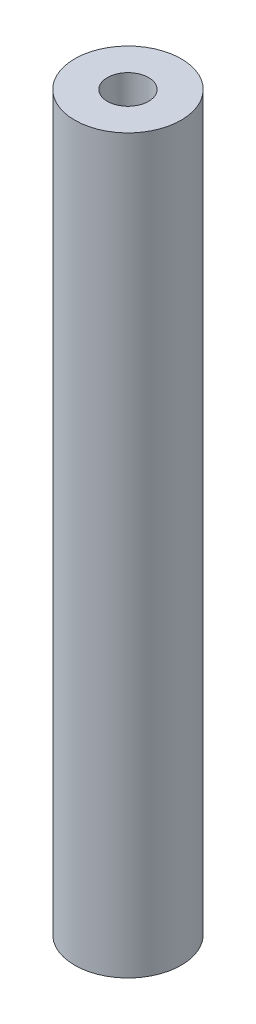
ISO-10303-21;
HEADER;
FILE_DESCRIPTION(('STEP AP214'),'2;1');
FILE_NAME('part.step','',(''),(''),'','','');
FILE_SCHEMA(('AUTOMOTIVE_DESIGN { 1 0 10303 214 1 1 1 1 }'));
ENDSEC;
DATA;
#1=APPLICATION_CONTEXT('core data for automotive mechanical design processes');
#2=APPLICATION_PROTOCOL_DEFINITION('international standard','automotive_design',2000,#1);
#3=PRODUCT_CONTEXT('',#1,'mechanical');
#4=PRODUCT('Part','Part','',(#3));
#5=PRODUCT_RELATED_PRODUCT_CATEGORY('part','',(#4));
#6=PRODUCT_DEFINITION_FORMATION('','',#4);
#7=PRODUCT_DEFINITION_CONTEXT('part definition',#1,'design');
#8=PRODUCT_DEFINITION('design','',#6,#7);
#9=PRODUCT_DEFINITION_SHAPE('','',#8);
#10=(LENGTH_UNIT() NAMED_UNIT(*) SI_UNIT(.MILLI.,.METRE.));
#11=(NAMED_UNIT(*) PLANE_ANGLE_UNIT() SI_UNIT($,.RADIAN.));
#12=(NAMED_UNIT(*) SI_UNIT($,.STERADIAN.) SOLID_ANGLE_UNIT());
#13=UNCERTAINTY_MEASURE_WITH_UNIT(LENGTH_MEASURE(1.E-05),#10,'distance_accuracy_value','');
#14=(GEOMETRIC_REPRESENTATION_CONTEXT(3) GLOBAL_UNCERTAINTY_ASSIGNED_CONTEXT((#13)) GLOBAL_UNIT_ASSIGNED_CONTEXT((#10,
#11,#12)) REPRESENTATION_CONTEXT('',''));
#15=CARTESIAN_POINT('',(0.,0.,0.));
#16=DIRECTION('',(0.,0.,1.));
#17=DIRECTION('',(1.,0.,0.));
#18=AXIS2_PLACEMENT_3D('',#15,#16,#17);
#19=CARTESIAN_POINT('',(0.,55.,0.));
#20=DIRECTION('',(0.,-1.,0.));
#21=DIRECTION('',(0.,0.,-1.));
#22=AXIS2_PLACEMENT_3D('',#19,#20,#21);
#23=CYLINDRICAL_SURFACE('',#22,4.);
#24=CARTESIAN_POINT('',(0.,55.,0.));
#25=DIRECTION('',(0.,1.,0.));
#26=DIRECTION('',(0.,0.,1.));
#27=AXIS2_PLACEMENT_3D('',#24,#25,#26);
#28=CIRCLE('',#27,4.);
#29=CARTESIAN_POINT('',(0.,55.,4.));
#30=VERTEX_POINT('',#29);
#31=EDGE_CURVE('E10',#30,#30,#28,.T.);
#32=ORIENTED_EDGE('',*,*,#31,.F.);
#33=EDGE_LOOP('',(#32));
#34=FACE_BOUND('',#33,.T.);
#35=CARTESIAN_POINT('',(0.,0.,0.));
#36=DIRECTION('',(0.,1.,0.));
#37=DIRECTION('',(0.,0.,1.));
#38=AXIS2_PLACEMENT_3D('',#35,#36,#37);
#39=CIRCLE('',#38,4.);
#40=CARTESIAN_POINT('',(0.,0.,4.));
#41=VERTEX_POINT('',#40);
#42=EDGE_CURVE('E40',#41,#41,#39,.T.);
#43=ORIENTED_EDGE('',*,*,#42,.T.);
#44=EDGE_LOOP('',(#43));
#45=FACE_BOUND('',#44,.T.);
#46=ADVANCED_FACE('F37',(#34,#45),#23,.T.);
#47=CARTESIAN_POINT('',(0.,55.,0.));
#48=DIRECTION('',(0.,1.,0.));
#49=DIRECTION('',(0.,0.,1.));
#50=AXIS2_PLACEMENT_3D('',#47,#48,#49);
#51=PLANE('',#50);
#52=CARTESIAN_POINT('',(0.,55.,0.));
#53=DIRECTION('',(0.,1.,0.));
#54=DIRECTION('',(0.,0.,1.));
#55=AXIS2_PLACEMENT_3D('',#52,#53,#54);
#56=CIRCLE('',#55,1.55);
#57=CARTESIAN_POINT('',(0.,55.,1.55));
#58=VERTEX_POINT('',#57);
#59=EDGE_CURVE('E51',#58,#58,#56,.T.);
#60=ORIENTED_EDGE('',*,*,#59,.F.);
#61=EDGE_LOOP('',(#60));
#62=FACE_BOUND('',#61,.T.);
#63=ORIENTED_EDGE('',*,*,#31,.T.);
#64=EDGE_LOOP('',(#63));
#65=FACE_BOUND('',#64,.T.);
#66=ADVANCED_FACE('F80',(#62,#65),#51,.T.);
#67=CARTESIAN_POINT('',(0.,0.,0.));
#68=DIRECTION('',(0.,1.,0.));
#69=DIRECTION('',(0.,0.,1.));
#70=AXIS2_PLACEMENT_3D('',#67,#68,#69);
#71=PLANE('',#70);
#72=CARTESIAN_POINT('',(0.,0.,0.));
#73=DIRECTION('',(0.,-1.,0.));
#74=DIRECTION('',(0.,0.,-1.));
#75=AXIS2_PLACEMENT_3D('',#72,#73,#74);
#76=CIRCLE('',#75,1.65);
#77=CARTESIAN_POINT('',(0.,0.,-1.65));
#78=VERTEX_POINT('',#77);
#79=EDGE_CURVE('E59',#78,#78,#76,.T.);
#80=ORIENTED_EDGE('',*,*,#79,.F.);
#81=EDGE_LOOP('',(#80));
#82=FACE_BOUND('',#81,.T.);
#83=ORIENTED_EDGE('',*,*,#42,.F.);
#84=EDGE_LOOP('',(#83));
#85=FACE_BOUND('',#84,.T.);
#86=ADVANCED_FACE('F76',(#82,#85),#71,.F.);
#87=CARTESIAN_POINT('',(0.,45.,0.));
#88=DIRECTION('',(0.,1.,0.));
#89=DIRECTION('',(0.,0.,1.));
#90=AXIS2_PLACEMENT_3D('',#87,#88,#89);
#91=CYLINDRICAL_SURFACE('',#90,1.55);
#92=CARTESIAN_POINT('',(0.,45.,0.));
#93=DIRECTION('',(0.,1.,0.));
#94=DIRECTION('',(0.,0.,1.));
#95=AXIS2_PLACEMENT_3D('',#92,#93,#94);
#96=CIRCLE('',#95,1.55);
#97=CARTESIAN_POINT('',(0.,45.,1.55));
#98=VERTEX_POINT('',#97);
#99=EDGE_CURVE('E49',#98,#98,#96,.T.);
#100=ORIENTED_EDGE('',*,*,#99,.F.);
#101=EDGE_LOOP('',(#100));
#102=FACE_BOUND('',#101,.T.);
#103=ORIENTED_EDGE('',*,*,#59,.T.);
#104=EDGE_LOOP('',(#103));
#105=FACE_BOUND('',#104,.T.);
#106=ADVANCED_FACE('F79',(#102,#105),#91,.F.);
#107=CARTESIAN_POINT('',(0.,45.,0.));
#108=DIRECTION('',(0.,1.,0.));
#109=DIRECTION('',(0.,0.,1.));
#110=AXIS2_PLACEMENT_3D('',#107,#108,#109);
#111=PLANE('',#110);
#112=ORIENTED_EDGE('',*,*,#99,.T.);
#113=EDGE_LOOP('',(#112));
#114=FACE_BOUND('',#113,.T.);
#115=ADVANCED_FACE('F72',(#114),#111,.T.);
#116=CARTESIAN_POINT('',(0.,10.,0.));
#117=DIRECTION('',(0.,-1.,0.));
#118=DIRECTION('',(0.,0.,-1.));
#119=AXIS2_PLACEMENT_3D('',#116,#117,#118);
#120=CYLINDRICAL_SURFACE('',#119,1.65);
#121=CARTESIAN_POINT('',(0.,10.,0.));
#122=DIRECTION('',(0.,-1.,0.));
#123=DIRECTION('',(0.,0.,-1.));
#124=AXIS2_PLACEMENT_3D('',#121,#122,#123);
#125=CIRCLE('',#124,1.65);
#126=CARTESIAN_POINT('',(0.,10.,-1.65));
#127=VERTEX_POINT('',#126);
#128=EDGE_CURVE('E55',#127,#127,#125,.T.);
#129=ORIENTED_EDGE('',*,*,#128,.F.);
#130=EDGE_LOOP('',(#129));
#131=FACE_BOUND('',#130,.T.);
#132=ORIENTED_EDGE('',*,*,#79,.T.);
#133=EDGE_LOOP('',(#132));
#134=FACE_BOUND('',#133,.T.);
#135=ADVANCED_FACE('F69',(#131,#134),#120,.F.);
#136=CARTESIAN_POINT('',(0.,10.,0.));
#137=DIRECTION('',(0.,-1.,0.));
#138=DIRECTION('',(0.,0.,-1.));
#139=AXIS2_PLACEMENT_3D('',#136,#137,#138);
#140=PLANE('',#139);
#141=ORIENTED_EDGE('',*,*,#128,.T.);
#142=EDGE_LOOP('',(#141));
#143=FACE_BOUND('',#142,.T.);
#144=ADVANCED_FACE('F67',(#143),#140,.T.);
#145=CLOSED_SHELL('',(#46,#66,#86,#106,#115,#135,#144));
#146=MANIFOLD_SOLID_BREP('B2',#145);
#147=ADVANCED_BREP_SHAPE_REPRESENTATION('',(#18,#146),#14);
#148=SHAPE_DEFINITION_REPRESENTATION(#9,#147);
ENDSEC;
END-ISO-10303-21;
